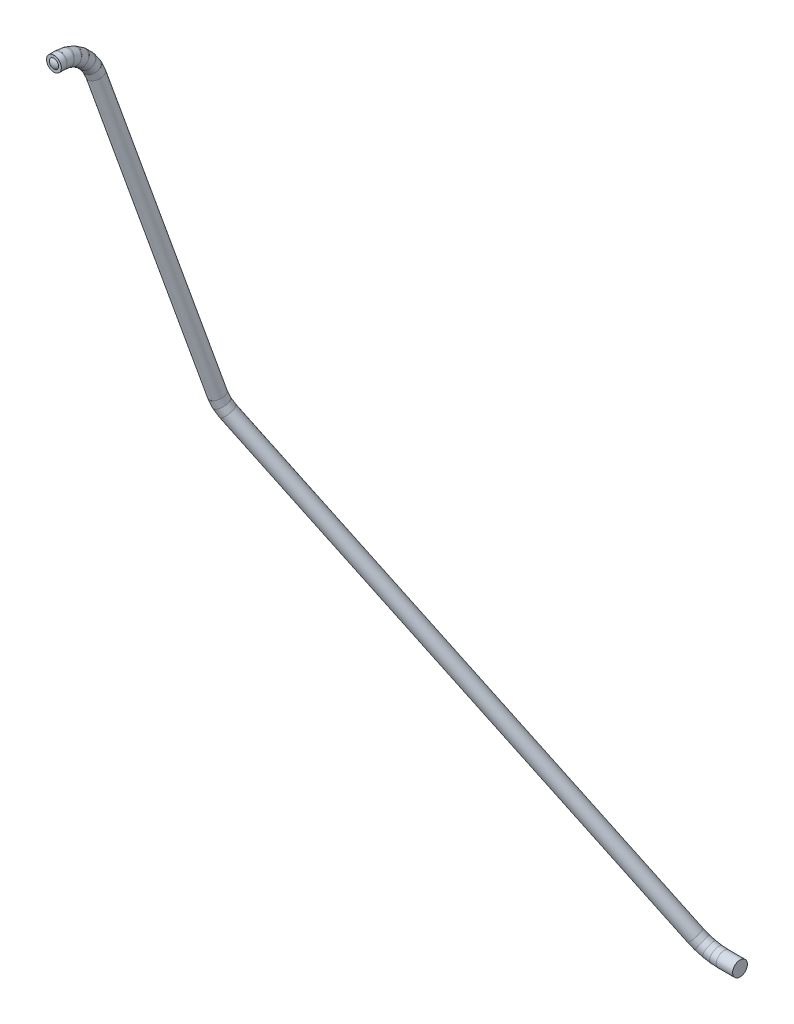
ISO-10303-21;
HEADER;
FILE_DESCRIPTION(('STEP AP214'),'2;1');
FILE_NAME('part.step','',(''),(''),'','','');
FILE_SCHEMA(('AUTOMOTIVE_DESIGN { 1 0 10303 214 1 1 1 1 }'));
ENDSEC;
DATA;
#1=APPLICATION_CONTEXT('core data for automotive mechanical design processes');
#2=APPLICATION_PROTOCOL_DEFINITION('international standard','automotive_design',2000,#1);
#3=PRODUCT_CONTEXT('',#1,'mechanical');
#4=PRODUCT('Part','Part','',(#3));
#5=PRODUCT_RELATED_PRODUCT_CATEGORY('part','',(#4));
#6=PRODUCT_DEFINITION_FORMATION('','',#4);
#7=PRODUCT_DEFINITION_CONTEXT('part definition',#1,'design');
#8=PRODUCT_DEFINITION('design','',#6,#7);
#9=PRODUCT_DEFINITION_SHAPE('','',#8);
#10=(LENGTH_UNIT() NAMED_UNIT(*) SI_UNIT(.MILLI.,.METRE.));
#11=(NAMED_UNIT(*) PLANE_ANGLE_UNIT() SI_UNIT($,.RADIAN.));
#12=(NAMED_UNIT(*) SI_UNIT($,.STERADIAN.) SOLID_ANGLE_UNIT());
#13=UNCERTAINTY_MEASURE_WITH_UNIT(LENGTH_MEASURE(1.E-05),#10,'distance_accuracy_value','');
#14=(GEOMETRIC_REPRESENTATION_CONTEXT(3) GLOBAL_UNCERTAINTY_ASSIGNED_CONTEXT((#13)) GLOBAL_UNIT_ASSIGNED_CONTEXT((#10,
#11,#12)) REPRESENTATION_CONTEXT('',''));
#15=CARTESIAN_POINT('',(0.,0.,0.));
#16=DIRECTION('',(0.,0.,1.));
#17=DIRECTION('',(1.,0.,0.));
#18=AXIS2_PLACEMENT_3D('',#15,#16,#17);
#19=CARTESIAN_POINT('',(-41.8,-156.,234.));
#20=DIRECTION('',(-1.,0.,0.));
#21=DIRECTION('',(0.,0.,1.));
#22=AXIS2_PLACEMENT_3D('',#19,#20,#21);
#23=PLANE('',#22);
#24=CARTESIAN_POINT('',(-41.8,-156.,234.));
#25=DIRECTION('',(-1.,0.,0.));
#26=DIRECTION('',(0.,0.,-1.));
#27=AXIS2_PLACEMENT_3D('',#24,#25,#26);
#28=CIRCLE('',#27,1.9);
#29=CARTESIAN_POINT('',(-41.8,-156.,232.1));
#30=VERTEX_POINT('',#29);
#31=EDGE_CURVE('P0_E10',#30,#30,#28,.T.);
#32=ORIENTED_EDGE('',*,*,#31,.F.);
#33=EDGE_LOOP('',(#32));
#34=FACE_BOUND('',#33,.T.);
#35=ADVANCED_FACE('P0_F15',(#34),#23,.F.);
#36=CARTESIAN_POINT('',(-46.03494202966,-156.,234.));
#37=DIRECTION('',(-1.,0.,0.));
#38=DIRECTION('',(0.,0.,1.));
#39=AXIS2_PLACEMENT_3D('',#36,#37,#38);
#40=PLANE('',#39);
#41=CARTESIAN_POINT('',(-46.03494202966,-156.,234.));
#42=DIRECTION('',(-1.,0.,0.));
#43=DIRECTION('',(0.,0.,-1.));
#44=AXIS2_PLACEMENT_3D('',#41,#42,#43);
#45=CIRCLE('',#44,1.9);
#46=CARTESIAN_POINT('',(-46.03494202966,-156.,232.1));
#47=VERTEX_POINT('',#46);
#48=EDGE_CURVE('P0_E39',#47,#47,#45,.T.);
#49=ORIENTED_EDGE('',*,*,#48,.T.);
#50=EDGE_LOOP('',(#49));
#51=FACE_BOUND('',#50,.T.);
#52=ADVANCED_FACE('P0_F43',(#51),#40,.T.);
#53=CARTESIAN_POINT('',(-41.8,-156.,234.));
#54=DIRECTION('',(-1.,0.,0.));
#55=DIRECTION('',(0.,0.,-1.));
#56=AXIS2_PLACEMENT_3D('',#53,#54,#55);
#57=CYLINDRICAL_SURFACE('',#56,1.9);
#58=ORIENTED_EDGE('',*,*,#48,.F.);
#59=DIRECTION('',(-1.,0.,0.));
#60=VECTOR('',#59,1.);
#61=CARTESIAN_POINT('',(-41.8,-156.,232.1));
#62=LINE('',#61,#60);
#63=EDGE_CURVE('P0_E25',#30,#47,#62,.T.);
#64=ORIENTED_EDGE('',*,*,#63,.F.);
#65=ORIENTED_EDGE('',*,*,#31,.T.);
#66=ORIENTED_EDGE('',*,*,#63,.T.);
#67=EDGE_LOOP('',(#58,#64,#65,#66));
#68=FACE_BOUND('',#67,.T.);
#69=ADVANCED_FACE('P0_F17',(#68),#57,.T.);
#70=CLOSED_SHELL('',(#35,#52,#69));
#71=MANIFOLD_SOLID_BREP('P0_B1',#70);
#72=CARTESIAN_POINT('',(-46.03494202966,-156.,234.));
#73=DIRECTION('',(-0.993959428889801,0.102078097874979,0.0403077617251019));
#74=DIRECTION('',(0.040519419454629,0.,0.999178751098651));
#75=AXIS2_PLACEMENT_3D('',#72,#73,#74);
#76=PLANE('',#75);
#77=CARTESIAN_POINT('',(-46.03494202966,-156.,234.));
#78=DIRECTION('',(-0.993959428889773,0.102078097875246,0.0403077617251019));
#79=DIRECTION('',(-0.102161122999959,-0.994767864854604,0.));
#80=AXIS2_PLACEMENT_3D('',#77,#78,#79);
#81=CIRCLE('',#80,1.9);
#82=CARTESIAN_POINT('',(-46.22904816336,-157.8900589432,234.));
#83=VERTEX_POINT('',#82);
#84=EDGE_CURVE('P1_E11',#83,#83,#81,.T.);
#85=ORIENTED_EDGE('',*,*,#84,.F.);
#86=EDGE_LOOP('',(#85));
#87=FACE_BOUND('',#86,.T.);
#88=ADVANCED_FACE('P1_F16',(#87),#76,.F.);
#89=CARTESIAN_POINT('',(-47.78030516944,-155.8207539017,234.07077922852));
#90=DIRECTION('',(-0.993959428889801,0.102078097874979,0.0403077617251019));
#91=DIRECTION('',(0.040519419454629,0.,0.999178751098651));
#92=AXIS2_PLACEMENT_3D('',#89,#90,#91);
#93=PLANE('',#92);
#94=CARTESIAN_POINT('',(-47.78030516944,-155.8207539017,234.07077922852));
#95=DIRECTION('',(-0.993959428889773,0.102078097875246,0.0403077617251019));
#96=DIRECTION('',(-0.102161122999959,-0.994767864854604,0.));
#97=AXIS2_PLACEMENT_3D('',#94,#95,#96);
#98=CIRCLE('',#97,1.9);
#99=CARTESIAN_POINT('',(-47.97441130314,-157.710812845,234.07077922852));
#100=VERTEX_POINT('',#99);
#101=EDGE_CURVE('P1_E40',#100,#100,#98,.T.);
#102=ORIENTED_EDGE('',*,*,#101,.T.);
#103=EDGE_LOOP('',(#102));
#104=FACE_BOUND('',#103,.T.);
#105=ADVANCED_FACE('P1_F44',(#104),#93,.T.);
#106=CARTESIAN_POINT('',(-46.03494202966,-156.,234.));
#107=DIRECTION('',(-0.993959428889773,0.102078097875246,0.0403077617251019));
#108=DIRECTION('',(-0.102161122999959,-0.994767864854604,0.));
#109=AXIS2_PLACEMENT_3D('',#106,#107,#108);
#110=CYLINDRICAL_SURFACE('',#109,1.9);
#111=ORIENTED_EDGE('',*,*,#101,.F.);
#112=DIRECTION('',(-0.993959428889801,0.102078097874979,0.0403077617251019));
#113=VECTOR('',#112,1.);
#114=CARTESIAN_POINT('',(-46.22904816336,-157.8900589432,234.));
#115=LINE('',#114,#113);
#116=EDGE_CURVE('P1_E25',#83,#100,#115,.T.);
#117=ORIENTED_EDGE('',*,*,#116,.F.);
#118=ORIENTED_EDGE('',*,*,#84,.T.);
#119=ORIENTED_EDGE('',*,*,#116,.T.);
#120=EDGE_LOOP('',(#111,#117,#118,#119));
#121=FACE_BOUND('',#120,.T.);
#122=ADVANCED_FACE('P1_F39',(#121),#110,.T.);
#123=CLOSED_SHELL('',(#88,#105,#122));
#124=MANIFOLD_SOLID_BREP('P1_B1',#123);
#125=CARTESIAN_POINT('',(-47.78030516944,-155.8207539017,234.07077922852));
#126=DIRECTION('',(-0.946071840354511,0.301316312260162,0.118981313046064));
#127=DIRECTION('',(0.124780585341046,0.,0.992184360651762));
#128=AXIS2_PLACEMENT_3D('',#125,#126,#127);
#129=PLANE('',#128);
#130=CARTESIAN_POINT('',(-47.78030516944,-155.8207539017,234.07077922852));
#131=DIRECTION('',(-0.946071840354403,0.301316312260502,0.118981313046064));
#132=DIRECTION('',(-0.303472027729901,-0.952840347794688,0.));
#133=AXIS2_PLACEMENT_3D('',#130,#131,#132);
#134=CIRCLE('',#133,1.9);
#135=CARTESIAN_POINT('',(-48.35690202213,-157.6311505625,234.07077922852));
#136=VERTEX_POINT('',#135);
#137=EDGE_CURVE('P2_E11',#136,#136,#134,.T.);
#138=ORIENTED_EDGE('',*,*,#137,.F.);
#139=EDGE_LOOP('',(#138));
#140=FACE_BOUND('',#139,.T.);
#141=ADVANCED_FACE('P2_F16',(#140),#129,.F.);
#142=CARTESIAN_POINT('',(-49.44157913067,-155.2916514358,234.2797068689));
#143=DIRECTION('',(-0.946071840354511,0.301316312260162,0.118981313046064));
#144=DIRECTION('',(0.124780585341046,0.,0.992184360651762));
#145=AXIS2_PLACEMENT_3D('',#142,#143,#144);
#146=PLANE('',#145);
#147=CARTESIAN_POINT('',(-49.44157913067,-155.2916514358,234.2797068689));
#148=DIRECTION('',(-0.946071840354403,0.301316312260502,0.118981313046064));
#149=DIRECTION('',(-0.303472027729901,-0.952840347794688,0.));
#150=AXIS2_PLACEMENT_3D('',#147,#148,#149);
#151=CIRCLE('',#150,1.9);
#152=CARTESIAN_POINT('',(-50.01817598336,-157.1020480966,234.2797068689));
#153=VERTEX_POINT('',#152);
#154=EDGE_CURVE('P2_E40',#153,#153,#151,.T.);
#155=ORIENTED_EDGE('',*,*,#154,.T.);
#156=EDGE_LOOP('',(#155));
#157=FACE_BOUND('',#156,.T.);
#158=ADVANCED_FACE('P2_F43',(#157),#146,.T.);
#159=CARTESIAN_POINT('',(-47.78030516944,-155.8207539017,234.07077922852));
#160=DIRECTION('',(-0.946071840354403,0.301316312260502,0.118981313046064));
#161=DIRECTION('',(-0.303472027729901,-0.952840347794688,0.));
#162=AXIS2_PLACEMENT_3D('',#159,#160,#161);
#163=CYLINDRICAL_SURFACE('',#162,1.9);
#164=ORIENTED_EDGE('',*,*,#154,.F.);
#165=DIRECTION('',(-0.946071840354511,0.301316312260162,0.118981313046064));
#166=VECTOR('',#165,1.);
#167=CARTESIAN_POINT('',(-48.35690202213,-157.6311505625,234.07077922852));
#168=LINE('',#167,#166);
#169=EDGE_CURVE('P2_E20',#136,#153,#168,.T.);
#170=ORIENTED_EDGE('',*,*,#169,.F.);
#171=ORIENTED_EDGE('',*,*,#137,.T.);
#172=ORIENTED_EDGE('',*,*,#169,.T.);
#173=EDGE_LOOP('',(#164,#170,#171,#172));
#174=FACE_BOUND('',#173,.T.);
#175=ADVANCED_FACE('P2_F18',(#174),#163,.T.);
#176=CLOSED_SHELL('',(#141,#158,#175));
#177=MANIFOLD_SOLID_BREP('P2_B1',#176);
#178=CARTESIAN_POINT('',(-49.44157913067,-155.2916514358,234.2797068689));
#179=DIRECTION('',(-0.852603820969844,0.486037524077911,0.191922509507965));
#180=DIRECTION('',(0.219606565232133,0.,0.975588518027424));
#181=AXIS2_PLACEMENT_3D('',#178,#179,#180);
#182=PLANE('',#181);
#183=CARTESIAN_POINT('',(-49.44157913067,-155.2916514358,234.2797068689));
#184=DIRECTION('',(-0.852603820969742,0.486037524078092,0.191922509507965));
#185=DIRECTION('',(-0.495244070410795,-0.868753883860641,0.));
#186=AXIS2_PLACEMENT_3D('',#183,#184,#185);
#187=CIRCLE('',#186,1.9);
#188=CARTESIAN_POINT('',(-50.38254286446,-156.9422838152,234.2797068689));
#189=VERTEX_POINT('',#188);
#190=EDGE_CURVE('P3_E11',#189,#189,#187,.T.);
#191=ORIENTED_EDGE('',*,*,#190,.F.);
#192=EDGE_LOOP('',(#191));
#193=FACE_BOUND('',#192,.T.);
#194=ADVANCED_FACE('P3_F16',(#193),#182,.F.);
#195=CARTESIAN_POINT('',(-50.93872603497,-154.4381840262,234.61671707682));
#196=DIRECTION('',(-0.852603820969844,0.486037524077911,0.191922509507965));
#197=DIRECTION('',(0.219606565232133,0.,0.975588518027424));
#198=AXIS2_PLACEMENT_3D('',#195,#196,#197);
#199=PLANE('',#198);
#200=CARTESIAN_POINT('',(-50.93872603497,-154.4381840262,234.61671707682));
#201=DIRECTION('',(-0.852603820969742,0.486037524078092,0.191922509507965));
#202=DIRECTION('',(-0.495244070410795,-0.868753883860641,0.));
#203=AXIS2_PLACEMENT_3D('',#200,#201,#202);
#204=CIRCLE('',#203,1.9);
#205=CARTESIAN_POINT('',(-51.87968976875,-156.0888164055,234.61671707682));
#206=VERTEX_POINT('',#205);
#207=EDGE_CURVE('P3_E40',#206,#206,#204,.T.);
#208=ORIENTED_EDGE('',*,*,#207,.T.);
#209=EDGE_LOOP('',(#208));
#210=FACE_BOUND('',#209,.T.);
#211=ADVANCED_FACE('P3_F44',(#210),#199,.T.);
#212=CARTESIAN_POINT('',(-49.44157913067,-155.2916514358,234.2797068689));
#213=DIRECTION('',(-0.852603820969742,0.486037524078092,0.191922509507965));
#214=DIRECTION('',(-0.495244070410795,-0.868753883860641,0.));
#215=AXIS2_PLACEMENT_3D('',#212,#213,#214);
#216=CYLINDRICAL_SURFACE('',#215,1.9);
#217=ORIENTED_EDGE('',*,*,#207,.F.);
#218=DIRECTION('',(-0.852603820969845,0.486037524077911,0.191922509507965));
#219=VECTOR('',#218,1.);
#220=CARTESIAN_POINT('',(-50.38254286446,-156.9422838152,234.2797068689));
#221=LINE('',#220,#219);
#222=EDGE_CURVE('P3_E25',#189,#206,#221,.T.);
#223=ORIENTED_EDGE('',*,*,#222,.F.);
#224=ORIENTED_EDGE('',*,*,#190,.T.);
#225=ORIENTED_EDGE('',*,*,#222,.T.);
#226=EDGE_LOOP('',(#217,#223,#224,#225));
#227=FACE_BOUND('',#226,.T.);
#228=ADVANCED_FACE('P3_F39',(#227),#216,.T.);
#229=CLOSED_SHELL('',(#194,#211,#228));
#230=MANIFOLD_SOLID_BREP('P3_B1',#229);
#231=CARTESIAN_POINT('',(-50.93872603497,-154.4381840262,234.61671707682));
#232=DIRECTION('',(-0.718058530445358,0.647342121204323,0.255617145296128));
#233=DIRECTION('',(0.33536773932147,0.,0.942087299257562));
#234=AXIS2_PLACEMENT_3D('',#231,#232,#233);
#235=PLANE('',#234);
#236=CARTESIAN_POINT('',(-50.93872603497,-154.4381840262,234.61671707682));
#237=DIRECTION('',(-0.718058530445434,0.647342121204238,0.255617145296128));
#238=DIRECTION('',(-0.669587083111195,-0.742733557967217,0.));
#239=AXIS2_PLACEMENT_3D('',#236,#237,#238);
#240=CIRCLE('',#239,1.9);
#241=CARTESIAN_POINT('',(-52.21094149288,-155.8493777863,234.61671707682));
#242=VERTEX_POINT('',#241);
#243=EDGE_CURVE('P4_E11',#242,#242,#240,.T.);
#244=ORIENTED_EDGE('',*,*,#243,.F.);
#245=EDGE_LOOP('',(#244));
#246=FACE_BOUND('',#245,.T.);
#247=ADVANCED_FACE('P4_F16',(#246),#235,.F.);
#248=CARTESIAN_POINT('',(-52.19961541819,-153.3014705504,235.06557316724));
#249=DIRECTION('',(-0.718058530445358,0.647342121204323,0.255617145296128));
#250=DIRECTION('',(0.33536773932147,0.,0.942087299257562));
#251=AXIS2_PLACEMENT_3D('',#248,#249,#250);
#252=PLANE('',#251);
#253=CARTESIAN_POINT('',(-52.19961541819,-153.3014705504,235.06557316724));
#254=DIRECTION('',(-0.718058530445434,0.647342121204238,0.255617145296128));
#255=DIRECTION('',(-0.669587083111195,-0.742733557967217,0.));
#256=AXIS2_PLACEMENT_3D('',#253,#254,#255);
#257=CIRCLE('',#256,1.9);
#258=CARTESIAN_POINT('',(-53.4718308761,-154.7126643106,235.06557316724));
#259=VERTEX_POINT('',#258);
#260=EDGE_CURVE('P4_E41',#259,#259,#257,.T.);
#261=ORIENTED_EDGE('',*,*,#260,.T.);
#262=EDGE_LOOP('',(#261));
#263=FACE_BOUND('',#262,.T.);
#264=ADVANCED_FACE('P4_F44',(#263),#252,.T.);
#265=CARTESIAN_POINT('',(-50.93872603497,-154.4381840262,234.61671707682));
#266=DIRECTION('',(-0.718058530445434,0.647342121204238,0.255617145296128));
#267=DIRECTION('',(-0.669587083111195,-0.742733557967217,0.));
#268=AXIS2_PLACEMENT_3D('',#265,#266,#267);
#269=CYLINDRICAL_SURFACE('',#268,1.9);
#270=ORIENTED_EDGE('',*,*,#260,.F.);
#271=DIRECTION('',(-0.718058530445358,0.647342121204323,0.255617145296128));
#272=VECTOR('',#271,1.);
#273=CARTESIAN_POINT('',(-52.21094149288,-155.8493777863,234.61671707682));
#274=LINE('',#273,#272);
#275=EDGE_CURVE('P4_E19',#242,#259,#274,.T.);
#276=ORIENTED_EDGE('',*,*,#275,.F.);
#277=ORIENTED_EDGE('',*,*,#243,.T.);
#278=ORIENTED_EDGE('',*,*,#275,.T.);
#279=EDGE_LOOP('',(#270,#276,#277,#278));
#280=FACE_BOUND('',#279,.T.);
#281=ADVANCED_FACE('P4_F40',(#280),#269,.T.);
#282=CLOSED_SHELL('',(#247,#264,#281));
#283=MANIFOLD_SOLID_BREP('P4_B1',#282);
#284=CARTESIAN_POINT('',(-52.19961541819,-153.3014705504,235.06557316724));
#285=DIRECTION('',(-0.6373382394379,0.716729854039887,0.283016403902956));
#286=DIRECTION('',(0.405845023891917,0.,0.913941910945203));
#287=AXIS2_PLACEMENT_3D('',#284,#285,#286);
#288=PLANE('',#287);
#289=CARTESIAN_POINT('',(-52.19961541819,-153.3014705504,235.06557316724));
#290=DIRECTION('',(-0.637338239438537,0.71672985403932,0.283016403902956));
#291=DIRECTION('',(0.747282445438176,0.664506543790157,0.));
#292=AXIS2_PLACEMENT_3D('',#289,#290,#291);
#293=CIRCLE('',#292,1.9);
#294=CARTESIAN_POINT('',(-50.77977877186,-152.0389081172,235.06557316724));
#295=VERTEX_POINT('',#294);
#296=EDGE_CURVE('P5_E11',#295,#295,#293,.T.);
#297=ORIENTED_EDGE('',*,*,#296,.F.);
#298=EDGE_LOOP('',(#297));
#299=FACE_BOUND('',#298,.T.);
#300=ADVANCED_FACE('P5_F16',(#299),#288,.F.);
#301=CARTESIAN_POINT('',(-135.2252966736,-59.93348989985,271.93395527031));
#302=DIRECTION('',(-0.6373382394379,0.716729854039887,0.283016403902956));
#303=DIRECTION('',(0.405845023891917,0.,0.913941910945203));
#304=AXIS2_PLACEMENT_3D('',#301,#302,#303);
#305=PLANE('',#304);
#306=CARTESIAN_POINT('',(-135.2252966736,-59.93348989985,271.93395527031));
#307=DIRECTION('',(-0.637338239438537,0.71672985403932,0.283016403902956));
#308=DIRECTION('',(0.747282445438176,0.664506543790157,0.));
#309=AXIS2_PLACEMENT_3D('',#306,#307,#308);
#310=CIRCLE('',#309,1.9);
#311=CARTESIAN_POINT('',(-133.8054600273,-58.67092746665,271.93395527031));
#312=VERTEX_POINT('',#311);
#313=EDGE_CURVE('P5_E41',#312,#312,#310,.T.);
#314=ORIENTED_EDGE('',*,*,#313,.T.);
#315=EDGE_LOOP('',(#314));
#316=FACE_BOUND('',#315,.T.);
#317=ADVANCED_FACE('P5_F44',(#316),#305,.T.);
#318=CARTESIAN_POINT('',(-52.19961541819,-153.3014705504,235.06557316724));
#319=DIRECTION('',(-0.637338239438537,0.71672985403932,0.283016403902956));
#320=DIRECTION('',(0.747282445438176,0.664506543790157,0.));
#321=AXIS2_PLACEMENT_3D('',#318,#319,#320);
#322=CYLINDRICAL_SURFACE('',#321,1.9);
#323=ORIENTED_EDGE('',*,*,#313,.F.);
#324=DIRECTION('',(-0.6373382394379,0.716729854039887,0.283016403902956));
#325=VECTOR('',#324,1.);
#326=CARTESIAN_POINT('',(-50.77977877186,-152.0389081172,235.06557316724));
#327=LINE('',#326,#325);
#328=EDGE_CURVE('P5_E19',#295,#312,#327,.T.);
#329=ORIENTED_EDGE('',*,*,#328,.F.);
#330=ORIENTED_EDGE('',*,*,#296,.T.);
#331=ORIENTED_EDGE('',*,*,#328,.T.);
#332=EDGE_LOOP('',(#323,#329,#330,#331));
#333=FACE_BOUND('',#332,.T.);
#334=ADVANCED_FACE('P5_F40',(#333),#322,.T.);
#335=CLOSED_SHELL('',(#300,#317,#334));
#336=MANIFOLD_SOLID_BREP('P5_B1',#335);
#337=CARTESIAN_POINT('',(-135.2252966736,-59.93348989985,271.93395527031));
#338=DIRECTION('',(-0.544302671061946,0.794884891534921,0.268127975944974));
#339=DIRECTION('',(0.441901019304139,0.,0.897063815532632));
#340=AXIS2_PLACEMENT_3D('',#337,#338,#339);
#341=PLANE('',#340);
#342=CARTESIAN_POINT('',(-135.2252966736,-59.93348989985,271.93395527031));
#343=DIRECTION('',(-0.544302671062292,0.794884891534684,0.268127975944974));
#344=DIRECTION('',(0.825097226672232,0.564990766772159,0.));
#345=AXIS2_PLACEMENT_3D('',#342,#343,#344);
#346=CIRCLE('',#345,1.9);
#347=CARTESIAN_POINT('',(-133.6576119429,-58.86000744298,271.93395527031));
#348=VERTEX_POINT('',#347);
#349=EDGE_CURVE('P6_E11',#348,#348,#346,.T.);
#350=ORIENTED_EDGE('',*,*,#349,.F.);
#351=EDGE_LOOP('',(#350));
#352=FACE_BOUND('',#351,.T.);
#353=ADVANCED_FACE('P6_F16',(#352),#341,.F.);
#354=CARTESIAN_POINT('',(-136.2893929202,-58.37951253669,272.45813783999));
#355=DIRECTION('',(-0.544302671061946,0.794884891534921,0.268127975944974));
#356=DIRECTION('',(0.441901019304139,0.,0.897063815532632));
#357=AXIS2_PLACEMENT_3D('',#354,#355,#356);
#358=PLANE('',#357);
#359=CARTESIAN_POINT('',(-136.2893929202,-58.37951253669,272.45813783999));
#360=DIRECTION('',(-0.544302671062292,0.794884891534684,0.268127975944974));
#361=DIRECTION('',(0.825097226672232,0.564990766772159,0.));
#362=AXIS2_PLACEMENT_3D('',#359,#360,#361);
#363=CIRCLE('',#362,1.9);
#364=CARTESIAN_POINT('',(-134.7217081895,-57.30603007983,272.45813783999));
#365=VERTEX_POINT('',#364);
#366=EDGE_CURVE('P6_E41',#365,#365,#363,.T.);
#367=ORIENTED_EDGE('',*,*,#366,.T.);
#368=EDGE_LOOP('',(#367));
#369=FACE_BOUND('',#368,.T.);
#370=ADVANCED_FACE('P6_F44',(#369),#358,.T.);
#371=CARTESIAN_POINT('',(-135.2252966736,-59.93348989985,271.93395527031));
#372=DIRECTION('',(-0.544302671062292,0.794884891534684,0.268127975944974));
#373=DIRECTION('',(0.825097226672232,0.564990766772159,0.));
#374=AXIS2_PLACEMENT_3D('',#371,#372,#373);
#375=CYLINDRICAL_SURFACE('',#374,1.9);
#376=ORIENTED_EDGE('',*,*,#366,.F.);
#377=DIRECTION('',(-0.544302671061946,0.794884891534921,0.268127975944974));
#378=VECTOR('',#377,1.);
#379=CARTESIAN_POINT('',(-133.6576119429,-58.86000744298,271.93395527031));
#380=LINE('',#379,#378);
#381=EDGE_CURVE('P6_E19',#348,#365,#380,.T.);
#382=ORIENTED_EDGE('',*,*,#381,.F.);
#383=ORIENTED_EDGE('',*,*,#349,.T.);
#384=ORIENTED_EDGE('',*,*,#381,.T.);
#385=EDGE_LOOP('',(#376,#382,#383,#384));
#386=FACE_BOUND('',#385,.T.);
#387=ADVANCED_FACE('P6_F40',(#386),#375,.T.);
#388=CLOSED_SHELL('',(#353,#370,#387));
#389=MANIFOLD_SOLID_BREP('P6_B1',#388);
#390=CARTESIAN_POINT('',(-136.2893929202,-58.37951253669,272.45813783999));
#391=DIRECTION('',(-0.335278019182943,0.914467054208846,0.226580353559962));
#392=DIRECTION('',(0.559927228084652,0.,0.828541790888932));
#393=AXIS2_PLACEMENT_3D('',#390,#391,#392);
#394=PLANE('',#393);
#395=CARTESIAN_POINT('',(-136.2893929202,-58.37951253669,272.45813783999));
#396=DIRECTION('',(-0.335278019183221,0.914467054208744,0.226580353559962));
#397=DIRECTION('',(0.938885131769846,0.344230604887943,0.));
#398=AXIS2_PLACEMENT_3D('',#395,#396,#397);
#399=CIRCLE('',#398,1.9);
#400=CARTESIAN_POINT('',(-134.5055111698,-57.72547438741,272.45813783999));
#401=VERTEX_POINT('',#400);
#402=EDGE_CURVE('P7_E11',#401,#401,#399,.T.);
#403=ORIENTED_EDGE('',*,*,#402,.F.);
#404=EDGE_LOOP('',(#403));
#405=FACE_BOUND('',#404,.T.);
#406=ADVANCED_FACE('P7_F16',(#405),#394,.F.);
#407=CARTESIAN_POINT('',(-136.9448519152,-56.59175544541,272.90109598918));
#408=DIRECTION('',(-0.335278019182943,0.914467054208846,0.226580353559962));
#409=DIRECTION('',(0.559927228084652,0.,0.828541790888932));
#410=AXIS2_PLACEMENT_3D('',#407,#408,#409);
#411=PLANE('',#410);
#412=CARTESIAN_POINT('',(-136.9448519152,-56.59175544541,272.90109598918));
#413=DIRECTION('',(-0.335278019183221,0.914467054208744,0.226580353559962));
#414=DIRECTION('',(0.938885131769846,0.344230604887943,0.));
#415=AXIS2_PLACEMENT_3D('',#412,#413,#414);
#416=CIRCLE('',#415,1.9);
#417=CARTESIAN_POINT('',(-135.1609701649,-55.93771729613,272.90109598918));
#418=VERTEX_POINT('',#417);
#419=EDGE_CURVE('P7_E41',#418,#418,#416,.T.);
#420=ORIENTED_EDGE('',*,*,#419,.T.);
#421=EDGE_LOOP('',(#420));
#422=FACE_BOUND('',#421,.T.);
#423=ADVANCED_FACE('P7_F44',(#422),#411,.T.);
#424=CARTESIAN_POINT('',(-136.2893929202,-58.37951253669,272.45813783999));
#425=DIRECTION('',(-0.335278019183221,0.914467054208744,0.226580353559962));
#426=DIRECTION('',(0.938885131769846,0.344230604887943,0.));
#427=AXIS2_PLACEMENT_3D('',#424,#425,#426);
#428=CYLINDRICAL_SURFACE('',#427,1.9);
#429=ORIENTED_EDGE('',*,*,#419,.F.);
#430=DIRECTION('',(-0.335278019182943,0.914467054208846,0.226580353559962));
#431=VECTOR('',#430,1.);
#432=CARTESIAN_POINT('',(-134.5055111698,-57.72547438741,272.45813783999));
#433=LINE('',#432,#431);
#434=EDGE_CURVE('P7_E19',#401,#418,#433,.T.);
#435=ORIENTED_EDGE('',*,*,#434,.F.);
#436=ORIENTED_EDGE('',*,*,#402,.T.);
#437=ORIENTED_EDGE('',*,*,#434,.T.);
#438=EDGE_LOOP('',(#429,#435,#436,#437));
#439=FACE_BOUND('',#438,.T.);
#440=ADVANCED_FACE('P7_F40',(#439),#428,.T.);
#441=CLOSED_SHELL('',(#406,#423,#440));
#442=MANIFOLD_SOLID_BREP('P7_B1',#441);
#443=CARTESIAN_POINT('',(-136.9448519152,-56.59175544541,272.90109598918));
#444=DIRECTION('',(-0.222421272960999,0.954102181826995,0.200543770701999));
#445=DIRECTION('',(0.669637121796192,0.,0.742688444175962));
#446=AXIS2_PLACEMENT_3D('',#443,#444,#445);
#447=PLANE('',#446);
#448=CARTESIAN_POINT('',(-136.9448519152,-56.59175544541,272.90109598918));
#449=DIRECTION('',(-0.222421272960634,0.95410218182708,0.200543770701999));
#450=DIRECTION('',(0.973886945226561,0.22703351716713,0.));
#451=AXIS2_PLACEMENT_3D('',#448,#449,#450);
#452=CIRCLE('',#451,1.9);
#453=CARTESIAN_POINT('',(-135.0944667193,-56.16039176279,272.90109598918));
#454=VERTEX_POINT('',#453);
#455=EDGE_CURVE('P8_E11',#454,#454,#452,.T.);
#456=ORIENTED_EDGE('',*,*,#455,.F.);
#457=EDGE_LOOP('',(#456));
#458=FACE_BOUND('',#457,.T.);
#459=ADVANCED_FACE('P8_F16',(#458),#447,.F.);
#460=CARTESIAN_POINT('',(-153.3479731235,13.771360120057,287.69079543924));
#461=DIRECTION('',(-0.222421272960999,0.954102181826995,0.200543770701999));
#462=DIRECTION('',(0.669637121796192,0.,0.742688444175962));
#463=AXIS2_PLACEMENT_3D('',#460,#461,#462);
#464=PLANE('',#463);
#465=CARTESIAN_POINT('',(-153.3479731235,13.771360120057,287.69079543924));
#466=DIRECTION('',(-0.222421272960634,0.95410218182708,0.200543770701999));
#467=DIRECTION('',(0.973886945226561,0.22703351716713,0.));
#468=AXIS2_PLACEMENT_3D('',#465,#466,#467);
#469=CIRCLE('',#468,1.9);
#470=CARTESIAN_POINT('',(-151.4975879275,14.202723802675,287.69079543924));
#471=VERTEX_POINT('',#470);
#472=EDGE_CURVE('P8_E40',#471,#471,#469,.T.);
#473=ORIENTED_EDGE('',*,*,#472,.T.);
#474=EDGE_LOOP('',(#473));
#475=FACE_BOUND('',#474,.T.);
#476=ADVANCED_FACE('P8_F43',(#475),#464,.T.);
#477=CARTESIAN_POINT('',(-136.9448519152,-56.59175544541,272.90109598918));
#478=DIRECTION('',(-0.222421272960634,0.95410218182708,0.200543770701999));
#479=DIRECTION('',(0.973886945226561,0.22703351716713,0.));
#480=AXIS2_PLACEMENT_3D('',#477,#478,#479);
#481=CYLINDRICAL_SURFACE('',#480,1.9);
#482=ORIENTED_EDGE('',*,*,#472,.F.);
#483=DIRECTION('',(-0.222421272960999,0.954102181826995,0.200543770701999));
#484=VECTOR('',#483,1.);
#485=CARTESIAN_POINT('',(-135.0944667193,-56.16039176279,272.90109598918));
#486=LINE('',#485,#484);
#487=EDGE_CURVE('P8_E19',#454,#471,#486,.T.);
#488=ORIENTED_EDGE('',*,*,#487,.F.);
#489=ORIENTED_EDGE('',*,*,#455,.T.);
#490=ORIENTED_EDGE('',*,*,#487,.T.);
#491=EDGE_LOOP('',(#482,#488,#489,#490));
#492=FACE_BOUND('',#491,.T.);
#493=ADVANCED_FACE('P8_F39',(#492),#481,.T.);
#494=CLOSED_SHELL('',(#459,#476,#493));
#495=MANIFOLD_SOLID_BREP('P8_B1',#494);
#496=CARTESIAN_POINT('',(-153.3479731235,13.771360120057,287.69079543924));
#497=DIRECTION('',(-0.215793148183083,0.925670061879356,0.31075433019912));
#498=DIRECTION('',(0.821380454345942,0.,0.570380705510324));
#499=AXIS2_PLACEMENT_3D('',#496,#497,#498);
#500=PLANE('',#499);
#501=CARTESIAN_POINT('',(-153.3479731235,13.771360120057,287.69079543924));
#502=DIRECTION('',(-0.215793148183083,0.925670061879562,0.310754330198507));
#503=DIRECTION('',(0.,-0.318252648838862,0.948005934320587));
#504=AXIS2_PLACEMENT_3D('',#501,#502,#503);
#505=CIRCLE('',#504,1.9);
#506=CARTESIAN_POINT('',(-153.3479731235,13.166680087263,289.49200671445));
#507=VERTEX_POINT('',#506);
#508=EDGE_CURVE('P9_E11',#507,#507,#505,.T.);
#509=ORIENTED_EDGE('',*,*,#508,.F.);
#510=EDGE_LOOP('',(#509));
#511=FACE_BOUND('',#510,.T.);
#512=ADVANCED_FACE('P9_F16',(#511),#500,.F.);
#513=CARTESIAN_POINT('',(-153.7409803495,15.457210789085,288.25674805783));
#514=DIRECTION('',(-0.215793148183083,0.925670061879356,0.31075433019912));
#515=DIRECTION('',(0.821380454345942,0.,0.570380705510324));
#516=AXIS2_PLACEMENT_3D('',#513,#514,#515);
#517=PLANE('',#516);
#518=CARTESIAN_POINT('',(-153.7409803495,15.457210789085,288.25674805783));
#519=DIRECTION('',(-0.215793148183083,0.925670061879562,0.310754330198507));
#520=DIRECTION('',(0.,-0.318252648838862,0.948005934320587));
#521=AXIS2_PLACEMENT_3D('',#518,#519,#520);
#522=CIRCLE('',#521,1.9);
#523=CARTESIAN_POINT('',(-153.7409803495,14.852530756291,290.05795933304));
#524=VERTEX_POINT('',#523);
#525=EDGE_CURVE('P9_E41',#524,#524,#522,.T.);
#526=ORIENTED_EDGE('',*,*,#525,.T.);
#527=EDGE_LOOP('',(#526));
#528=FACE_BOUND('',#527,.T.);
#529=ADVANCED_FACE('P9_F18',(#528),#517,.T.);
#530=CARTESIAN_POINT('',(-153.3479731235,13.771360120057,287.69079543924));
#531=DIRECTION('',(-0.215793148183083,0.925670061879562,0.310754330198507));
#532=DIRECTION('',(0.,-0.318252648838862,0.948005934320587));
#533=AXIS2_PLACEMENT_3D('',#530,#531,#532);
#534=CYLINDRICAL_SURFACE('',#533,1.9);
#535=ORIENTED_EDGE('',*,*,#525,.F.);
#536=DIRECTION('',(-0.215793148183083,0.925670061879356,0.31075433019912));
#537=VECTOR('',#536,1.);
#538=CARTESIAN_POINT('',(-153.3479731235,13.166680087263,289.49200671445));
#539=LINE('',#538,#537);
#540=EDGE_CURVE('P9_E26',#507,#524,#539,.T.);
#541=ORIENTED_EDGE('',*,*,#540,.F.);
#542=ORIENTED_EDGE('',*,*,#508,.T.);
#543=ORIENTED_EDGE('',*,*,#540,.T.);
#544=EDGE_LOOP('',(#535,#541,#542,#543));
#545=FACE_BOUND('',#544,.T.);
#546=ADVANCED_FACE('P9_F40',(#545),#534,.T.);
#547=CLOSED_SHELL('',(#512,#529,#546));
#548=MANIFOLD_SOLID_BREP('P9_B1',#547);
#549=CARTESIAN_POINT('',(-153.7409803495,15.457210789085,288.25674805783));
#550=DIRECTION('',(-0.194244435782969,0.833234328356869,0.517677170845918));
#551=DIRECTION('',(0.936260485129831,0.,0.351306566953216));
#552=AXIS2_PLACEMENT_3D('',#549,#550,#551);
#553=PLANE('',#552);
#554=CARTESIAN_POINT('',(-153.7409803495,15.457210789085,288.25674805783));
#555=DIRECTION('',(-0.194244435782969,0.833234328356923,0.517677170845831));
#556=DIRECTION('',(0.,-0.527728736444907,0.84941296242185));
#557=AXIS2_PLACEMENT_3D('',#554,#555,#556);
#558=CIRCLE('',#557,1.9);
#559=CARTESIAN_POINT('',(-153.7409803495,14.454526189839,289.87063268643));
#560=VERTEX_POINT('',#559);
#561=EDGE_CURVE('P10_E11',#560,#560,#558,.T.);
#562=ORIENTED_EDGE('',*,*,#561,.F.);
#563=EDGE_LOOP('',(#562));
#564=FACE_BOUND('',#563,.T.);
#565=ADVANCED_FACE('P10_F16',(#564),#553,.F.);
#566=CARTESIAN_POINT('',(-154.0947425867,16.974715467875,289.19955310333));
#567=DIRECTION('',(-0.194244435782969,0.833234328356869,0.517677170845918));
#568=DIRECTION('',(0.936260485129831,0.,0.351306566953216));
#569=AXIS2_PLACEMENT_3D('',#566,#567,#568);
#570=PLANE('',#569);
#571=CARTESIAN_POINT('',(-154.0947425867,16.974715467875,289.19955310333));
#572=DIRECTION('',(-0.194244435782969,0.833234328356923,0.517677170845831));
#573=DIRECTION('',(0.,-0.527728736444907,0.84941296242185));
#574=AXIS2_PLACEMENT_3D('',#571,#572,#573);
#575=CIRCLE('',#574,1.9);
#576=CARTESIAN_POINT('',(-154.0947425867,15.972030868629,290.81343773194));
#577=VERTEX_POINT('',#576);
#578=EDGE_CURVE('P10_E19',#577,#577,#575,.T.);
#579=ORIENTED_EDGE('',*,*,#578,.T.);
#580=EDGE_LOOP('',(#579));
#581=FACE_BOUND('',#580,.T.);
#582=ADVANCED_FACE('P10_F44',(#581),#570,.T.);
#583=CARTESIAN_POINT('',(-153.7409803495,15.457210789085,288.25674805783));
#584=DIRECTION('',(-0.194244435782969,0.833234328356923,0.517677170845831));
#585=DIRECTION('',(0.,-0.527728736444907,0.84941296242185));
#586=AXIS2_PLACEMENT_3D('',#583,#584,#585);
#587=CYLINDRICAL_SURFACE('',#586,1.9);
#588=ORIENTED_EDGE('',*,*,#578,.F.);
#589=DIRECTION('',(-0.194244435782969,0.833234328356869,0.517677170845918));
#590=VECTOR('',#589,1.);
#591=CARTESIAN_POINT('',(-153.7409803495,14.454526189839,289.87063268643));
#592=LINE('',#591,#590);
#593=EDGE_CURVE('P10_E25',#560,#577,#592,.T.);
#594=ORIENTED_EDGE('',*,*,#593,.F.);
#595=ORIENTED_EDGE('',*,*,#561,.T.);
#596=ORIENTED_EDGE('',*,*,#593,.T.);
#597=EDGE_LOOP('',(#588,#594,#595,#596));
#598=FACE_BOUND('',#597,.T.);
#599=ADVANCED_FACE('P10_F41',(#598),#587,.T.);
#600=CLOSED_SHELL('',(#565,#582,#599));
#601=MANIFOLD_SOLID_BREP('P10_B1',#600);
#602=CARTESIAN_POINT('',(-154.0947425867,16.974715467875,289.19955310333));
#603=DIRECTION('',(-0.162628855186983,0.697615580993928,0.697770991525928));
#604=DIRECTION('',(0.973886945226529,0.227033517167268,0.));
#605=AXIS2_PLACEMENT_3D('',#602,#603,#604);
#606=PLANE('',#605);
#607=CARTESIAN_POINT('',(-154.0947425867,16.974715467875,289.19955310333));
#608=DIRECTION('',(-0.162628855186983,0.697615580994067,0.697770991525789));
#609=DIRECTION('',(0.,0.70718553048997,-0.70702802311197));
#610=AXIS2_PLACEMENT_3D('',#607,#608,#609);
#611=CIRCLE('',#610,1.9);
#612=CARTESIAN_POINT('',(-154.0947425867,18.318367975807,287.85619985942));
#613=VERTEX_POINT('',#612);
#614=EDGE_CURVE('P11_E11',#613,#613,#611,.T.);
#615=ORIENTED_EDGE('',*,*,#614,.F.);
#616=EDGE_LOOP('',(#615));
#617=FACE_BOUND('',#616,.T.);
#618=ADVANCED_FACE('P11_F16',(#617),#606,.F.);
#619=CARTESIAN_POINT('',(-154.3909258335,18.245228302173,290.47034897471));
#620=DIRECTION('',(-0.162628855186983,0.697615580993928,0.697770991525928));
#621=DIRECTION('',(0.973886945226529,0.227033517167268,0.));
#622=AXIS2_PLACEMENT_3D('',#619,#620,#621);
#623=PLANE('',#622);
#624=CARTESIAN_POINT('',(-154.3909258335,18.245228302173,290.47034897471));
#625=DIRECTION('',(-0.162628855186983,0.697615580994067,0.697770991525789));
#626=DIRECTION('',(0.,0.70718553048997,-0.70702802311197));
#627=AXIS2_PLACEMENT_3D('',#624,#625,#626);
#628=CIRCLE('',#627,1.9);
#629=CARTESIAN_POINT('',(-154.3909258335,19.588880810104,289.1269957308));
#630=VERTEX_POINT('',#629);
#631=EDGE_CURVE('P11_E20',#630,#630,#628,.T.);
#632=ORIENTED_EDGE('',*,*,#631,.T.);
#633=EDGE_LOOP('',(#632));
#634=FACE_BOUND('',#633,.T.);
#635=ADVANCED_FACE('P11_F18',(#634),#623,.T.);
#636=CARTESIAN_POINT('',(-154.0947425867,16.974715467875,289.19955310333));
#637=DIRECTION('',(-0.162628855186983,0.697615580994067,0.697770991525789));
#638=DIRECTION('',(0.,0.70718553048997,-0.70702802311197));
#639=AXIS2_PLACEMENT_3D('',#636,#637,#638);
#640=CYLINDRICAL_SURFACE('',#639,1.9);
#641=ORIENTED_EDGE('',*,*,#631,.F.);
#642=DIRECTION('',(-0.162628855186983,0.697615580993928,0.697770991525928));
#643=VECTOR('',#642,1.);
#644=CARTESIAN_POINT('',(-154.0947425867,18.318367975807,287.85619985942));
#645=LINE('',#644,#643);
#646=EDGE_CURVE('P11_E26',#613,#630,#645,.T.);
#647=ORIENTED_EDGE('',*,*,#646,.F.);
#648=ORIENTED_EDGE('',*,*,#614,.T.);
#649=ORIENTED_EDGE('',*,*,#646,.T.);
#650=EDGE_LOOP('',(#641,#647,#648,#649));
#651=FACE_BOUND('',#650,.T.);
#652=ADVANCED_FACE('P11_F41',(#651),#640,.T.);
#653=CLOSED_SHELL('',(#618,#635,#652));
#654=MANIFOLD_SOLID_BREP('P11_B1',#653);
#655=CARTESIAN_POINT('',(-154.3909258335,18.245228302173,290.47034897471));
#656=DIRECTION('',(-0.122584908326013,0.525842366317054,0.841702290621087));
#657=DIRECTION('',(0.973886945226539,0.227033517167223,0.));
#658=AXIS2_PLACEMENT_3D('',#655,#656,#657);
#659=PLANE('',#658);
#660=CARTESIAN_POINT('',(-154.3909258335,18.245228302173,290.47034897471));
#661=DIRECTION('',(-0.122584908326013,0.525842366317286,0.841702290620942));
#662=DIRECTION('',(0.,0.848098625464477,-0.529838391856673));
#663=AXIS2_PLACEMENT_3D('',#660,#661,#662);
#664=CIRCLE('',#663,1.9);
#665=CARTESIAN_POINT('',(-154.3909258335,19.856615690555,289.46365603018));
#666=VERTEX_POINT('',#665);
#667=EDGE_CURVE('P12_E11',#666,#666,#664,.T.);
#668=ORIENTED_EDGE('',*,*,#667,.F.);
#669=EDGE_LOOP('',(#668));
#670=FACE_BOUND('',#669,.T.);
#671=ADVANCED_FACE('P12_F16',(#670),#659,.F.);
#672=CARTESIAN_POINT('',(-154.6141801637,19.202903981193,292.00327569256));
#673=DIRECTION('',(-0.122584908326013,0.525842366317054,0.841702290621087));
#674=DIRECTION('',(0.973886945226539,0.227033517167223,0.));
#675=AXIS2_PLACEMENT_3D('',#672,#673,#674);
#676=PLANE('',#675);
#677=CARTESIAN_POINT('',(-154.6141801637,19.202903981193,292.00327569256));
#678=DIRECTION('',(-0.122584908326013,0.525842366317286,0.841702290620942));
#679=DIRECTION('',(0.,0.848098625464477,-0.529838391856673));
#680=AXIS2_PLACEMENT_3D('',#677,#678,#679);
#681=CIRCLE('',#680,1.9);
#682=CARTESIAN_POINT('',(-154.6141801637,20.814291369576,290.99658274803));
#683=VERTEX_POINT('',#682);
#684=EDGE_CURVE('P12_E20',#683,#683,#681,.T.);
#685=ORIENTED_EDGE('',*,*,#684,.T.);
#686=EDGE_LOOP('',(#685));
#687=FACE_BOUND('',#686,.T.);
#688=ADVANCED_FACE('P12_F44',(#687),#676,.T.);
#689=CARTESIAN_POINT('',(-154.3909258335,18.245228302173,290.47034897471));
#690=DIRECTION('',(-0.122584908326013,0.525842366317286,0.841702290620942));
#691=DIRECTION('',(0.,0.848098625464477,-0.529838391856673));
#692=AXIS2_PLACEMENT_3D('',#689,#690,#691);
#693=CYLINDRICAL_SURFACE('',#692,1.9);
#694=ORIENTED_EDGE('',*,*,#684,.F.);
#695=DIRECTION('',(-0.122584908326013,0.525842366317054,0.841702290621087));
#696=VECTOR('',#695,1.);
#697=CARTESIAN_POINT('',(-154.3909258335,19.856615690555,289.46365603018));
#698=LINE('',#697,#696);
#699=EDGE_CURVE('P12_E27',#666,#683,#698,.T.);
#700=ORIENTED_EDGE('',*,*,#699,.F.);
#701=ORIENTED_EDGE('',*,*,#667,.T.);
#702=ORIENTED_EDGE('',*,*,#699,.T.);
#703=EDGE_LOOP('',(#694,#700,#701,#702));
#704=FACE_BOUND('',#703,.T.);
#705=ADVANCED_FACE('P12_F18',(#704),#693,.T.);
#706=CLOSED_SHELL('',(#671,#688,#705));
#707=MANIFOLD_SOLID_BREP('P12_B1',#706);
#708=CARTESIAN_POINT('',(-154.6141801637,19.202903981193,292.00327569256));
#709=DIRECTION('',(-0.0761879037326176,0.326816964098904,0.942011717178722));
#710=DIRECTION('',(0.973886945226482,0.227033517167468,0.));
#711=AXIS2_PLACEMENT_3D('',#708,#709,#710);
#712=PLANE('',#711);
#713=CARTESIAN_POINT('',(-154.6141801637,19.202903981193,292.00327569256));
#714=DIRECTION('',(-0.0761879037326176,0.326816964098774,0.942011717178767));
#715=DIRECTION('',(0.,0.944757676408259,-0.32776963384009));
#716=AXIS2_PLACEMENT_3D('',#713,#714,#715);
#717=CIRCLE('',#716,1.9);
#718=CARTESIAN_POINT('',(-154.6141801637,20.997943566369,291.38051338826));
#719=VERTEX_POINT('',#718);
#720=EDGE_CURVE('P13_E11',#719,#719,#717,.T.);
#721=ORIENTED_EDGE('',*,*,#720,.F.);
#722=EDGE_LOOP('',(#721));
#723=FACE_BOUND('',#722,.T.);
#724=ADVANCED_FACE('P13_F16',(#723),#712,.F.);
#725=CARTESIAN_POINT('',(-154.7529352491,19.798110221803,293.71888814351));
#726=DIRECTION('',(-0.0761879037326176,0.326816964098904,0.942011717178722));
#727=DIRECTION('',(0.973886945226482,0.227033517167468,0.));
#728=AXIS2_PLACEMENT_3D('',#725,#726,#727);
#729=PLANE('',#728);
#730=CARTESIAN_POINT('',(-154.7529352491,19.798110221803,293.71888814351));
#731=DIRECTION('',(-0.0761879037326176,0.326816964098774,0.942011717178767));
#732=DIRECTION('',(0.,0.944757676408259,-0.32776963384009));
#733=AXIS2_PLACEMENT_3D('',#730,#731,#732);
#734=CIRCLE('',#733,1.9);
#735=CARTESIAN_POINT('',(-154.7529352491,21.593149806978,293.09612583922));
#736=VERTEX_POINT('',#735);
#737=EDGE_CURVE('P13_E20',#736,#736,#734,.T.);
#738=ORIENTED_EDGE('',*,*,#737,.T.);
#739=EDGE_LOOP('',(#738));
#740=FACE_BOUND('',#739,.T.);
#741=ADVANCED_FACE('P13_F44',(#740),#729,.T.);
#742=CARTESIAN_POINT('',(-154.6141801637,19.202903981193,292.00327569256));
#743=DIRECTION('',(-0.0761879037326176,0.326816964098774,0.942011717178768));
#744=DIRECTION('',(0.,0.944757676408259,-0.32776963384009));
#745=AXIS2_PLACEMENT_3D('',#742,#743,#744);
#746=CYLINDRICAL_SURFACE('',#745,1.9);
#747=ORIENTED_EDGE('',*,*,#737,.F.);
#748=DIRECTION('',(-0.0761879037326176,0.326816964098903,0.942011717178722));
#749=VECTOR('',#748,1.);
#750=CARTESIAN_POINT('',(-154.6141801637,20.997943566369,291.38051338826));
#751=LINE('',#750,#749);
#752=EDGE_CURVE('P13_E27',#719,#736,#751,.T.);
#753=ORIENTED_EDGE('',*,*,#752,.F.);
#754=ORIENTED_EDGE('',*,*,#720,.T.);
#755=ORIENTED_EDGE('',*,*,#752,.T.);
#756=EDGE_LOOP('',(#747,#753,#754,#755));
#757=FACE_BOUND('',#756,.T.);
#758=ADVANCED_FACE('P13_F18',(#757),#746,.T.);
#759=CLOSED_SHELL('',(#724,#741,#758));
#760=MANIFOLD_SOLID_BREP('P13_B1',#759);
#761=CARTESIAN_POINT('',(-154.7529352491,19.798110221803,293.71888814351));
#762=DIRECTION('',(-0.0258424020724798,0.110854019819042,0.993500657546377));
#763=DIRECTION('',(0.973886945226457,0.227033517167575,0.));
#764=AXIS2_PLACEMENT_3D('',#761,#762,#763);
#765=PLANE('',#764);
#766=CARTESIAN_POINT('',(-154.7529352491,19.798110221803,293.71888814351));
#767=DIRECTION('',(-0.0258424020724798,0.110854019818596,0.993500657546427));
#768=DIRECTION('',(0.,0.993832568445992,-0.110891054174999));
#769=AXIS2_PLACEMENT_3D('',#766,#767,#768);
#770=CIRCLE('',#769,1.9);
#771=CARTESIAN_POINT('',(-154.7529352491,21.68639210185,293.50819514058));
#772=VERTEX_POINT('',#771);
#773=EDGE_CURVE('P14_E11',#772,#772,#770,.T.);
#774=ORIENTED_EDGE('',*,*,#773,.F.);
#775=EDGE_LOOP('',(#774));
#776=FACE_BOUND('',#775,.T.);
#777=ADVANCED_FACE('P14_F16',(#776),#765,.F.);
#778=CARTESIAN_POINT('',(-154.8,20.,295.52827338474));
#779=DIRECTION('',(-0.0258424020724798,0.110854019819042,0.993500657546377));
#780=DIRECTION('',(0.973886945226457,0.227033517167575,0.));
#781=AXIS2_PLACEMENT_3D('',#778,#779,#780);
#782=PLANE('',#781);
#783=CARTESIAN_POINT('',(-154.8,20.,295.52827338474));
#784=DIRECTION('',(-0.0258424020724798,0.110854019818596,0.993500657546427));
#785=DIRECTION('',(0.,0.993832568445992,-0.110891054174999));
#786=AXIS2_PLACEMENT_3D('',#783,#784,#785);
#787=CIRCLE('',#786,1.9);
#788=CARTESIAN_POINT('',(-154.8,21.888281880047,295.3175803818));
#789=VERTEX_POINT('',#788);
#790=EDGE_CURVE('P14_E19',#789,#789,#787,.T.);
#791=ORIENTED_EDGE('',*,*,#790,.T.);
#792=EDGE_LOOP('',(#791));
#793=FACE_BOUND('',#792,.T.);
#794=ADVANCED_FACE('P14_F44',(#793),#782,.T.);
#795=CARTESIAN_POINT('',(-154.7529352491,19.798110221803,293.71888814351));
#796=DIRECTION('',(-0.0258424020724798,0.110854019818596,0.993500657546427));
#797=DIRECTION('',(0.,0.993832568445992,-0.110891054174999));
#798=AXIS2_PLACEMENT_3D('',#795,#796,#797);
#799=CYLINDRICAL_SURFACE('',#798,1.9);
#800=ORIENTED_EDGE('',*,*,#790,.F.);
#801=DIRECTION('',(-0.0258424020724798,0.110854019819042,0.993500657546377));
#802=VECTOR('',#801,1.);
#803=CARTESIAN_POINT('',(-154.7529352491,21.68639210185,293.50819514058));
#804=LINE('',#803,#802);
#805=EDGE_CURVE('P14_E25',#772,#789,#804,.T.);
#806=ORIENTED_EDGE('',*,*,#805,.F.);
#807=ORIENTED_EDGE('',*,*,#773,.T.);
#808=ORIENTED_EDGE('',*,*,#805,.T.);
#809=EDGE_LOOP('',(#800,#806,#807,#808));
#810=FACE_BOUND('',#809,.T.);
#811=ADVANCED_FACE('P14_F40',(#810),#799,.T.);
#812=CLOSED_SHELL('',(#777,#794,#811));
#813=MANIFOLD_SOLID_BREP('P14_B1',#812);
#814=CARTESIAN_POINT('',(-154.8,20.,295.52827338474));
#815=DIRECTION('',(0.,0.,1.));
#816=DIRECTION('',(1.,0.,0.));
#817=AXIS2_PLACEMENT_3D('',#814,#815,#816);
#818=PLANE('',#817);
#819=CARTESIAN_POINT('',(-154.8,20.,295.52827338474));
#820=DIRECTION('',(0.,0.,1.));
#821=DIRECTION('',(1.,0.,0.));
#822=AXIS2_PLACEMENT_3D('',#819,#820,#821);
#823=CIRCLE('',#822,1.9);
#824=CARTESIAN_POINT('',(-152.9,20.,295.52827338474));
#825=VERTEX_POINT('',#824);
#826=EDGE_CURVE('P15_E11',#825,#825,#823,.T.);
#827=ORIENTED_EDGE('',*,*,#826,.F.);
#828=EDGE_LOOP('',(#827));
#829=FACE_BOUND('',#828,.T.);
#830=ADVANCED_FACE('P15_F16',(#829),#818,.F.);
#831=CARTESIAN_POINT('',(-154.8,20.,297.));
#832=DIRECTION('',(0.,0.,1.));
#833=DIRECTION('',(1.,0.,0.));
#834=AXIS2_PLACEMENT_3D('',#831,#832,#833);
#835=PLANE('',#834);
#836=CARTESIAN_POINT('',(-154.8,20.,297.));
#837=DIRECTION('',(0.,0.,1.));
#838=DIRECTION('',(1.,0.,0.));
#839=AXIS2_PLACEMENT_3D('',#836,#837,#838);
#840=CIRCLE('',#839,1.9);
#841=CARTESIAN_POINT('',(-152.9,20.,297.));
#842=VERTEX_POINT('',#841);
#843=EDGE_CURVE('P15_E19',#842,#842,#840,.T.);
#844=ORIENTED_EDGE('',*,*,#843,.T.);
#845=EDGE_LOOP('',(#844));
#846=FACE_BOUND('',#845,.T.);
#847=ADVANCED_FACE('P15_F44',(#846),#835,.T.);
#848=CARTESIAN_POINT('',(-154.8,20.,295.52827338474));
#849=DIRECTION('',(0.,0.,1.));
#850=DIRECTION('',(1.,0.,0.));
#851=AXIS2_PLACEMENT_3D('',#848,#849,#850);
#852=CYLINDRICAL_SURFACE('',#851,1.9);
#853=ORIENTED_EDGE('',*,*,#843,.F.);
#854=DIRECTION('',(0.,0.,1.));
#855=VECTOR('',#854,1.);
#856=CARTESIAN_POINT('',(-152.9,20.,295.52827338474));
#857=LINE('',#856,#855);
#858=EDGE_CURVE('P15_E26',#825,#842,#857,.T.);
#859=ORIENTED_EDGE('',*,*,#858,.F.);
#860=ORIENTED_EDGE('',*,*,#826,.T.);
#861=ORIENTED_EDGE('',*,*,#858,.T.);
#862=EDGE_LOOP('',(#853,#859,#860,#861));
#863=FACE_BOUND('',#862,.T.);
#864=ADVANCED_FACE('P15_F40',(#863),#852,.T.);
#865=CLOSED_SHELL('',(#830,#847,#864));
#866=MANIFOLD_SOLID_BREP('P15_B1',#865);
#867=CARTESIAN_POINT('',(-46.03494202966,-156.,234.));
#868=DIRECTION('',(0.,0.,1.));
#869=DIRECTION('',(1.,0.,0.));
#870=AXIS2_PLACEMENT_3D('',#867,#868,#869);
#871=SPHERICAL_SURFACE('',#870,1.9);
#872=CARTESIAN_POINT('',(-46.03494202966,-156.,232.1));
#873=VERTEX_POINT('',#872);
#874=VERTEX_LOOP('',#873);
#875=FACE_BOUND('',#874,.T.);
#876=ADVANCED_FACE('P16_F14',(#875),#871,.T.);
#877=CLOSED_SHELL('',(#876));
#878=MANIFOLD_SOLID_BREP('P16_B1',#877);
#879=CARTESIAN_POINT('',(-47.78030516944,-155.8207539017,234.07077922852));
#880=DIRECTION('',(0.,0.,1.));
#881=DIRECTION('',(1.,0.,0.));
#882=AXIS2_PLACEMENT_3D('',#879,#880,#881);
#883=SPHERICAL_SURFACE('',#882,1.9);
#884=CARTESIAN_POINT('',(-47.78030516944,-155.8207539017,232.17077922852));
#885=VERTEX_POINT('',#884);
#886=VERTEX_LOOP('',#885);
#887=FACE_BOUND('',#886,.T.);
#888=ADVANCED_FACE('P17_F14',(#887),#883,.T.);
#889=CLOSED_SHELL('',(#888));
#890=MANIFOLD_SOLID_BREP('P17_B1',#889);
#891=CARTESIAN_POINT('',(-49.44157913067,-155.2916514358,234.2797068689));
#892=DIRECTION('',(0.,0.,1.));
#893=DIRECTION('',(1.,0.,0.));
#894=AXIS2_PLACEMENT_3D('',#891,#892,#893);
#895=SPHERICAL_SURFACE('',#894,1.9);
#896=CARTESIAN_POINT('',(-49.44157913067,-155.2916514358,232.3797068689));
#897=VERTEX_POINT('',#896);
#898=VERTEX_LOOP('',#897);
#899=FACE_BOUND('',#898,.T.);
#900=ADVANCED_FACE('P18_F14',(#899),#895,.T.);
#901=CLOSED_SHELL('',(#900));
#902=MANIFOLD_SOLID_BREP('P18_B1',#901);
#903=CARTESIAN_POINT('',(-50.93872603497,-154.4381840262,234.61671707682));
#904=DIRECTION('',(0.,0.,1.));
#905=DIRECTION('',(1.,0.,0.));
#906=AXIS2_PLACEMENT_3D('',#903,#904,#905);
#907=SPHERICAL_SURFACE('',#906,1.9);
#908=CARTESIAN_POINT('',(-50.93872603497,-154.4381840262,232.71671707682));
#909=VERTEX_POINT('',#908);
#910=VERTEX_LOOP('',#909);
#911=FACE_BOUND('',#910,.T.);
#912=ADVANCED_FACE('P19_F14',(#911),#907,.T.);
#913=CLOSED_SHELL('',(#912));
#914=MANIFOLD_SOLID_BREP('P19_B1',#913);
#915=CARTESIAN_POINT('',(-52.19961541819,-153.3014705504,235.06557316724));
#916=DIRECTION('',(0.,0.,1.));
#917=DIRECTION('',(1.,0.,0.));
#918=AXIS2_PLACEMENT_3D('',#915,#916,#917);
#919=SPHERICAL_SURFACE('',#918,1.9);
#920=CARTESIAN_POINT('',(-52.19961541819,-153.3014705504,233.16557316724));
#921=VERTEX_POINT('',#920);
#922=VERTEX_LOOP('',#921);
#923=FACE_BOUND('',#922,.T.);
#924=ADVANCED_FACE('P20_F14',(#923),#919,.T.);
#925=CLOSED_SHELL('',(#924));
#926=MANIFOLD_SOLID_BREP('P20_B1',#925);
#927=CARTESIAN_POINT('',(-135.2252966736,-59.93348989985,271.93395527031));
#928=DIRECTION('',(0.,0.,1.));
#929=DIRECTION('',(1.,0.,0.));
#930=AXIS2_PLACEMENT_3D('',#927,#928,#929);
#931=SPHERICAL_SURFACE('',#930,1.9);
#932=CARTESIAN_POINT('',(-135.2252966736,-59.93348989985,270.03395527031));
#933=VERTEX_POINT('',#932);
#934=VERTEX_LOOP('',#933);
#935=FACE_BOUND('',#934,.T.);
#936=ADVANCED_FACE('P21_F14',(#935),#931,.T.);
#937=CLOSED_SHELL('',(#936));
#938=MANIFOLD_SOLID_BREP('P21_B1',#937);
#939=CARTESIAN_POINT('',(-136.2893929202,-58.37951253669,272.45813783999));
#940=DIRECTION('',(0.,0.,1.));
#941=DIRECTION('',(1.,0.,0.));
#942=AXIS2_PLACEMENT_3D('',#939,#940,#941);
#943=SPHERICAL_SURFACE('',#942,1.9);
#944=CARTESIAN_POINT('',(-136.2893929202,-58.37951253669,270.55813783999));
#945=VERTEX_POINT('',#944);
#946=VERTEX_LOOP('',#945);
#947=FACE_BOUND('',#946,.T.);
#948=ADVANCED_FACE('P22_F14',(#947),#943,.T.);
#949=CLOSED_SHELL('',(#948));
#950=MANIFOLD_SOLID_BREP('P22_B1',#949);
#951=CARTESIAN_POINT('',(-136.9448519152,-56.59175544541,272.90109598918));
#952=DIRECTION('',(0.,0.,1.));
#953=DIRECTION('',(1.,0.,0.));
#954=AXIS2_PLACEMENT_3D('',#951,#952,#953);
#955=SPHERICAL_SURFACE('',#954,1.9);
#956=CARTESIAN_POINT('',(-136.9448519152,-56.59175544541,271.00109598918));
#957=VERTEX_POINT('',#956);
#958=VERTEX_LOOP('',#957);
#959=FACE_BOUND('',#958,.T.);
#960=ADVANCED_FACE('P23_F14',(#959),#955,.T.);
#961=CLOSED_SHELL('',(#960));
#962=MANIFOLD_SOLID_BREP('P23_B1',#961);
#963=CARTESIAN_POINT('',(-153.3479731235,13.771360120057,287.69079543924));
#964=DIRECTION('',(0.,0.,1.));
#965=DIRECTION('',(1.,0.,0.));
#966=AXIS2_PLACEMENT_3D('',#963,#964,#965);
#967=SPHERICAL_SURFACE('',#966,1.9);
#968=CARTESIAN_POINT('',(-153.3479731235,13.771360120057,285.79079543924));
#969=VERTEX_POINT('',#968);
#970=VERTEX_LOOP('',#969);
#971=FACE_BOUND('',#970,.T.);
#972=ADVANCED_FACE('P24_F14',(#971),#967,.T.);
#973=CLOSED_SHELL('',(#972));
#974=MANIFOLD_SOLID_BREP('P24_B1',#973);
#975=CARTESIAN_POINT('',(-153.7409803495,15.457210789085,288.25674805783));
#976=DIRECTION('',(0.,0.,1.));
#977=DIRECTION('',(1.,0.,0.));
#978=AXIS2_PLACEMENT_3D('',#975,#976,#977);
#979=SPHERICAL_SURFACE('',#978,1.9);
#980=CARTESIAN_POINT('',(-153.7409803495,15.457210789085,286.35674805783));
#981=VERTEX_POINT('',#980);
#982=VERTEX_LOOP('',#981);
#983=FACE_BOUND('',#982,.T.);
#984=ADVANCED_FACE('P25_F14',(#983),#979,.T.);
#985=CLOSED_SHELL('',(#984));
#986=MANIFOLD_SOLID_BREP('P25_B1',#985);
#987=CARTESIAN_POINT('',(-154.0947425867,16.974715467875,289.19955310333));
#988=DIRECTION('',(0.,0.,1.));
#989=DIRECTION('',(1.,0.,0.));
#990=AXIS2_PLACEMENT_3D('',#987,#988,#989);
#991=SPHERICAL_SURFACE('',#990,1.9);
#992=CARTESIAN_POINT('',(-154.0947425867,16.974715467875,287.29955310333));
#993=VERTEX_POINT('',#992);
#994=VERTEX_LOOP('',#993);
#995=FACE_BOUND('',#994,.T.);
#996=ADVANCED_FACE('P26_F14',(#995),#991,.T.);
#997=CLOSED_SHELL('',(#996));
#998=MANIFOLD_SOLID_BREP('P26_B1',#997);
#999=CARTESIAN_POINT('',(-154.3909258335,18.245228302173,290.47034897471));
#1000=DIRECTION('',(0.,0.,1.));
#1001=DIRECTION('',(1.,0.,0.));
#1002=AXIS2_PLACEMENT_3D('',#999,#1000,#1001);
#1003=SPHERICAL_SURFACE('',#1002,1.9);
#1004=CARTESIAN_POINT('',(-154.3909258335,18.245228302173,288.57034897471));
#1005=VERTEX_POINT('',#1004);
#1006=VERTEX_LOOP('',#1005);
#1007=FACE_BOUND('',#1006,.T.);
#1008=ADVANCED_FACE('P27_F14',(#1007),#1003,.T.);
#1009=CLOSED_SHELL('',(#1008));
#1010=MANIFOLD_SOLID_BREP('P27_B1',#1009);
#1011=CARTESIAN_POINT('',(-154.6141801637,19.202903981193,292.00327569256));
#1012=DIRECTION('',(0.,0.,1.));
#1013=DIRECTION('',(1.,0.,0.));
#1014=AXIS2_PLACEMENT_3D('',#1011,#1012,#1013);
#1015=SPHERICAL_SURFACE('',#1014,1.9);
#1016=CARTESIAN_POINT('',(-154.6141801637,19.202903981193,290.10327569256));
#1017=VERTEX_POINT('',#1016);
#1018=VERTEX_LOOP('',#1017);
#1019=FACE_BOUND('',#1018,.T.);
#1020=ADVANCED_FACE('P28_F14',(#1019),#1015,.T.);
#1021=CLOSED_SHELL('',(#1020));
#1022=MANIFOLD_SOLID_BREP('P28_B1',#1021);
#1023=CARTESIAN_POINT('',(-154.7529352491,19.798110221803,293.71888814351));
#1024=DIRECTION('',(0.,0.,1.));
#1025=DIRECTION('',(1.,0.,0.));
#1026=AXIS2_PLACEMENT_3D('',#1023,#1024,#1025);
#1027=SPHERICAL_SURFACE('',#1026,1.9);
#1028=CARTESIAN_POINT('',(-154.7529352491,19.798110221803,291.81888814351));
#1029=VERTEX_POINT('',#1028);
#1030=VERTEX_LOOP('',#1029);
#1031=FACE_BOUND('',#1030,.T.);
#1032=ADVANCED_FACE('P29_F14',(#1031),#1027,.T.);
#1033=CLOSED_SHELL('',(#1032));
#1034=MANIFOLD_SOLID_BREP('P29_B1',#1033);
#1035=CARTESIAN_POINT('',(-154.8,20.,295.52827338474));
#1036=DIRECTION('',(0.,0.,1.));
#1037=DIRECTION('',(1.,0.,0.));
#1038=AXIS2_PLACEMENT_3D('',#1035,#1036,#1037);
#1039=SPHERICAL_SURFACE('',#1038,1.9);
#1040=CARTESIAN_POINT('',(-154.8,20.,293.62827338474));
#1041=VERTEX_POINT('',#1040);
#1042=VERTEX_LOOP('',#1041);
#1043=FACE_BOUND('',#1042,.T.);
#1044=ADVANCED_FACE('P30_F13',(#1043),#1039,.T.);
#1045=CLOSED_SHELL('',(#1044));
#1046=MANIFOLD_SOLID_BREP('P30_B1',#1045);
#1047=ADVANCED_BREP_SHAPE_REPRESENTATION('',(#18,#71,#124,#177,#230,#283,#336,#389,#442,#495,
#548,#601,#654,#707,#760,#813,#866,#878,#890,#902,#914,#926,#938,#950,#962,#974,#986,#998,#1010,
#1022,#1034,#1046),#14);
#1048=SHAPE_DEFINITION_REPRESENTATION(#9,#1047);
ENDSEC;
END-ISO-10303-21;
